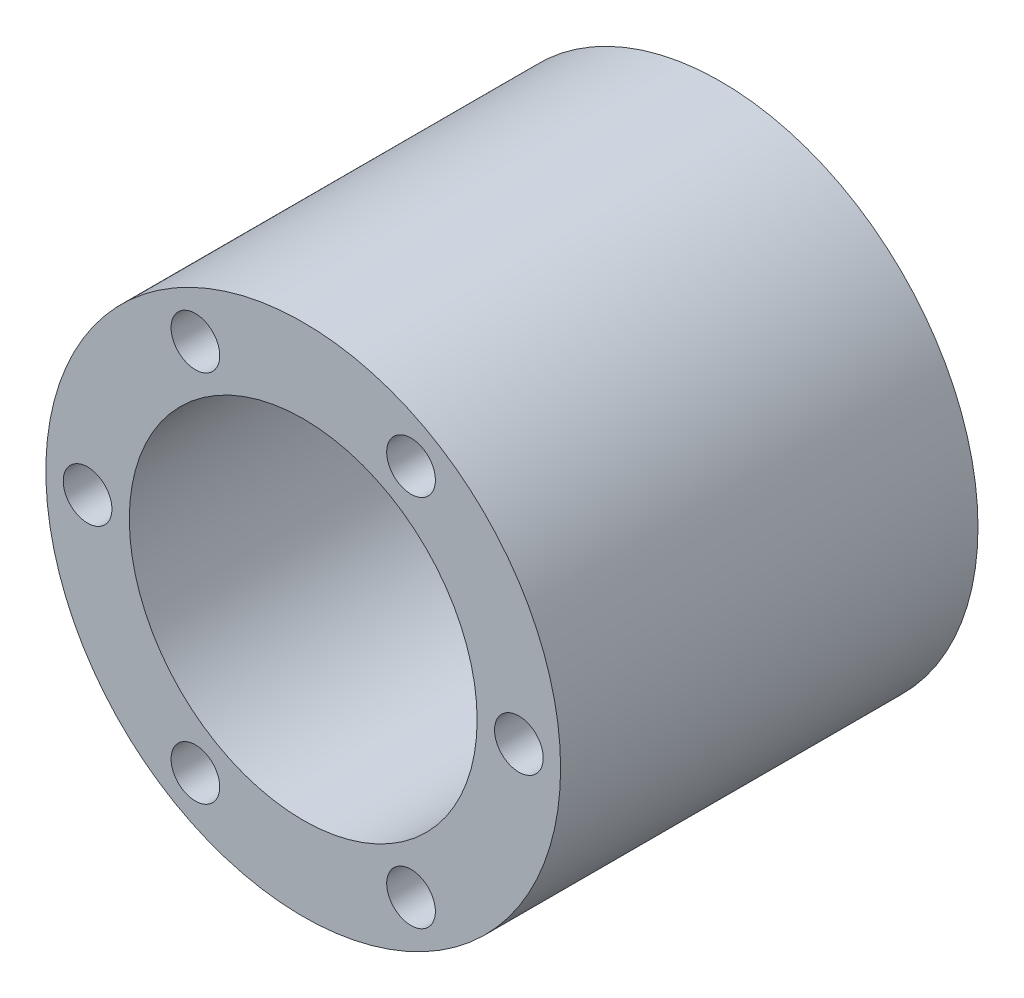
ISO-10303-21;
HEADER;
FILE_DESCRIPTION(('STEP AP214'),'2;1');
FILE_NAME('part.step','',(''),(''),'','','');
FILE_SCHEMA(('AUTOMOTIVE_DESIGN { 1 0 10303 214 1 1 1 1 }'));
ENDSEC;
DATA;
#1=APPLICATION_CONTEXT('core data for automotive mechanical design processes');
#2=APPLICATION_PROTOCOL_DEFINITION('international standard','automotive_design',2000,#1);
#3=PRODUCT_CONTEXT('',#1,'mechanical');
#4=PRODUCT('Part','Part','',(#3));
#5=PRODUCT_RELATED_PRODUCT_CATEGORY('part','',(#4));
#6=PRODUCT_DEFINITION_FORMATION('','',#4);
#7=PRODUCT_DEFINITION_CONTEXT('part definition',#1,'design');
#8=PRODUCT_DEFINITION('design','',#6,#7);
#9=PRODUCT_DEFINITION_SHAPE('','',#8);
#10=(LENGTH_UNIT() NAMED_UNIT(*) SI_UNIT(.MILLI.,.METRE.));
#11=(NAMED_UNIT(*) PLANE_ANGLE_UNIT() SI_UNIT($,.RADIAN.));
#12=(NAMED_UNIT(*) SI_UNIT($,.STERADIAN.) SOLID_ANGLE_UNIT());
#13=UNCERTAINTY_MEASURE_WITH_UNIT(LENGTH_MEASURE(1.E-05),#10,'distance_accuracy_value','');
#14=(GEOMETRIC_REPRESENTATION_CONTEXT(3) GLOBAL_UNCERTAINTY_ASSIGNED_CONTEXT((#13)) GLOBAL_UNIT_ASSIGNED_CONTEXT((#10,
#11,#12)) REPRESENTATION_CONTEXT('',''));
#15=CARTESIAN_POINT('',(0.,0.,0.));
#16=DIRECTION('',(0.,0.,1.));
#17=DIRECTION('',(1.,0.,0.));
#18=AXIS2_PLACEMENT_3D('',#15,#16,#17);
#19=CARTESIAN_POINT('',(0.,0.,30.));
#20=DIRECTION('',(0.,0.,1.));
#21=DIRECTION('',(1.,0.,0.));
#22=AXIS2_PLACEMENT_3D('',#19,#20,#21);
#23=PLANE('',#22);
#24=CARTESIAN_POINT('',(7.74999999999987,-13.4233937586589,30.));
#25=DIRECTION('',(0.,0.,1.));
#26=DIRECTION('',(1.,0.,0.));
#27=AXIS2_PLACEMENT_3D('',#24,#25,#26);
#28=CIRCLE('',#27,1.75);
#29=CARTESIAN_POINT('',(9.49999999999988,-13.4233937586589,30.));
#30=VERTEX_POINT('',#29);
#31=EDGE_CURVE('E90',#30,#30,#28,.T.);
#32=ORIENTED_EDGE('',*,*,#31,.F.);
#33=EDGE_LOOP('',(#32));
#34=FACE_BOUND('',#33,.T.);
#35=CARTESIAN_POINT('',(7.75000000000006,13.4233937586588,30.));
#36=DIRECTION('',(0.,0.,1.));
#37=DIRECTION('',(1.,0.,0.));
#38=AXIS2_PLACEMENT_3D('',#35,#36,#37);
#39=CIRCLE('',#38,1.75);
#40=CARTESIAN_POINT('',(9.50000000000006,13.4233937586588,30.));
#41=VERTEX_POINT('',#40);
#42=EDGE_CURVE('E74',#41,#41,#39,.T.);
#43=ORIENTED_EDGE('',*,*,#42,.F.);
#44=EDGE_LOOP('',(#43));
#45=FACE_BOUND('',#44,.T.);
#46=CARTESIAN_POINT('',(0.,0.,30.));
#47=DIRECTION('',(0.,0.,1.));
#48=DIRECTION('',(1.,0.,0.));
#49=AXIS2_PLACEMENT_3D('',#46,#47,#48);
#50=CIRCLE('',#49,12.5);
#51=CARTESIAN_POINT('',(12.5,0.,30.));
#52=VERTEX_POINT('',#51);
#53=EDGE_CURVE('E58',#52,#52,#50,.T.);
#54=ORIENTED_EDGE('',*,*,#53,.F.);
#55=EDGE_LOOP('',(#54));
#56=FACE_BOUND('',#55,.T.);
#57=CARTESIAN_POINT('',(0.,0.,30.));
#58=DIRECTION('',(0.,0.,1.));
#59=DIRECTION('',(1.,0.,0.));
#60=AXIS2_PLACEMENT_3D('',#57,#58,#59);
#61=CIRCLE('',#60,18.5);
#62=CARTESIAN_POINT('',(18.5,0.,30.));
#63=VERTEX_POINT('',#62);
#64=EDGE_CURVE('E10',#63,#63,#61,.T.);
#65=ORIENTED_EDGE('',*,*,#64,.T.);
#66=EDGE_LOOP('',(#65));
#67=FACE_BOUND('',#66,.T.);
#68=CARTESIAN_POINT('',(-15.5,0.,30.));
#69=DIRECTION('',(0.,0.,1.));
#70=DIRECTION('',(1.,0.,0.));
#71=AXIS2_PLACEMENT_3D('',#68,#69,#70);
#72=CIRCLE('',#71,1.75);
#73=CARTESIAN_POINT('',(-13.75,0.,30.));
#74=VERTEX_POINT('',#73);
#75=EDGE_CURVE('E53',#74,#74,#72,.T.);
#76=ORIENTED_EDGE('',*,*,#75,.F.);
#77=EDGE_LOOP('',(#76));
#78=FACE_BOUND('',#77,.T.);
#79=CARTESIAN_POINT('',(-7.74999999999997,13.4233937586588,30.));
#80=DIRECTION('',(0.,0.,1.));
#81=DIRECTION('',(1.,0.,0.));
#82=AXIS2_PLACEMENT_3D('',#79,#80,#81);
#83=CIRCLE('',#82,1.75);
#84=CARTESIAN_POINT('',(-5.99999999999997,13.4233937586588,30.));
#85=VERTEX_POINT('',#84);
#86=EDGE_CURVE('E66',#85,#85,#83,.T.);
#87=ORIENTED_EDGE('',*,*,#86,.F.);
#88=EDGE_LOOP('',(#87));
#89=FACE_BOUND('',#88,.T.);
#90=CARTESIAN_POINT('',(15.5,-1.08235921504137E-13,30.));
#91=DIRECTION('',(0.,0.,1.));
#92=DIRECTION('',(1.,0.,0.));
#93=AXIS2_PLACEMENT_3D('',#90,#91,#92);
#94=CIRCLE('',#93,1.75);
#95=CARTESIAN_POINT('',(17.25,-1.08235921504137E-13,30.));
#96=VERTEX_POINT('',#95);
#97=EDGE_CURVE('E82',#96,#96,#94,.T.);
#98=ORIENTED_EDGE('',*,*,#97,.F.);
#99=EDGE_LOOP('',(#98));
#100=FACE_BOUND('',#99,.T.);
#101=CARTESIAN_POINT('',(-7.75000000000016,-13.4233937586587,30.));
#102=DIRECTION('',(0.,0.,1.));
#103=DIRECTION('',(1.,0.,0.));
#104=AXIS2_PLACEMENT_3D('',#101,#102,#103);
#105=CIRCLE('',#104,1.75);
#106=CARTESIAN_POINT('',(-6.00000000000015,-13.4233937586587,30.));
#107=VERTEX_POINT('',#106);
#108=EDGE_CURVE('E98',#107,#107,#105,.T.);
#109=ORIENTED_EDGE('',*,*,#108,.F.);
#110=EDGE_LOOP('',(#109));
#111=FACE_BOUND('',#110,.T.);
#112=ADVANCED_FACE('F39',(#34,#45,#56,#67,#78,#89,#100,#111),#23,.T.);
#113=CARTESIAN_POINT('',(0.,0.,0.));
#114=DIRECTION('',(0.,0.,1.));
#115=DIRECTION('',(1.,0.,0.));
#116=AXIS2_PLACEMENT_3D('',#113,#114,#115);
#117=PLANE('',#116);
#118=CARTESIAN_POINT('',(0.,0.,0.));
#119=DIRECTION('',(0.,0.,1.));
#120=DIRECTION('',(1.,0.,0.));
#121=AXIS2_PLACEMENT_3D('',#118,#119,#120);
#122=CIRCLE('',#121,18.5);
#123=CARTESIAN_POINT('',(18.5,0.,0.));
#124=VERTEX_POINT('',#123);
#125=EDGE_CURVE('E43',#124,#124,#122,.T.);
#126=ORIENTED_EDGE('',*,*,#125,.F.);
#127=EDGE_LOOP('',(#126));
#128=FACE_BOUND('',#127,.T.);
#129=CARTESIAN_POINT('',(-15.5,0.,0.));
#130=DIRECTION('',(0.,0.,1.));
#131=DIRECTION('',(1.,0.,0.));
#132=AXIS2_PLACEMENT_3D('',#129,#130,#131);
#133=CIRCLE('',#132,1.75);
#134=CARTESIAN_POINT('',(-13.75,0.,0.));
#135=VERTEX_POINT('',#134);
#136=EDGE_CURVE('E55',#135,#135,#133,.T.);
#137=ORIENTED_EDGE('',*,*,#136,.T.);
#138=EDGE_LOOP('',(#137));
#139=FACE_BOUND('',#138,.T.);
#140=CARTESIAN_POINT('',(0.,0.,0.));
#141=DIRECTION('',(0.,0.,1.));
#142=DIRECTION('',(1.,0.,0.));
#143=AXIS2_PLACEMENT_3D('',#140,#141,#142);
#144=CIRCLE('',#143,12.5);
#145=CARTESIAN_POINT('',(12.5,0.,0.));
#146=VERTEX_POINT('',#145);
#147=EDGE_CURVE('E62',#146,#146,#144,.T.);
#148=ORIENTED_EDGE('',*,*,#147,.T.);
#149=EDGE_LOOP('',(#148));
#150=FACE_BOUND('',#149,.T.);
#151=CARTESIAN_POINT('',(-7.74999999999997,13.4233937586588,0.));
#152=DIRECTION('',(0.,0.,1.));
#153=DIRECTION('',(1.,0.,0.));
#154=AXIS2_PLACEMENT_3D('',#151,#152,#153);
#155=CIRCLE('',#154,1.75);
#156=CARTESIAN_POINT('',(-5.99999999999997,13.4233937586588,0.));
#157=VERTEX_POINT('',#156);
#158=EDGE_CURVE('E70',#157,#157,#155,.T.);
#159=ORIENTED_EDGE('',*,*,#158,.T.);
#160=EDGE_LOOP('',(#159));
#161=FACE_BOUND('',#160,.T.);
#162=CARTESIAN_POINT('',(7.75000000000006,13.4233937586588,0.));
#163=DIRECTION('',(0.,0.,1.));
#164=DIRECTION('',(1.,0.,0.));
#165=AXIS2_PLACEMENT_3D('',#162,#163,#164);
#166=CIRCLE('',#165,1.75);
#167=CARTESIAN_POINT('',(9.50000000000006,13.4233937586588,0.));
#168=VERTEX_POINT('',#167);
#169=EDGE_CURVE('E78',#168,#168,#166,.T.);
#170=ORIENTED_EDGE('',*,*,#169,.T.);
#171=EDGE_LOOP('',(#170));
#172=FACE_BOUND('',#171,.T.);
#173=CARTESIAN_POINT('',(15.5,-1.08235921504137E-13,0.));
#174=DIRECTION('',(0.,0.,1.));
#175=DIRECTION('',(1.,0.,0.));
#176=AXIS2_PLACEMENT_3D('',#173,#174,#175);
#177=CIRCLE('',#176,1.75);
#178=CARTESIAN_POINT('',(17.25,-1.08235921504137E-13,0.));
#179=VERTEX_POINT('',#178);
#180=EDGE_CURVE('E86',#179,#179,#177,.T.);
#181=ORIENTED_EDGE('',*,*,#180,.T.);
#182=EDGE_LOOP('',(#181));
#183=FACE_BOUND('',#182,.T.);
#184=CARTESIAN_POINT('',(7.74999999999987,-13.4233937586589,0.));
#185=DIRECTION('',(0.,0.,1.));
#186=DIRECTION('',(1.,0.,0.));
#187=AXIS2_PLACEMENT_3D('',#184,#185,#186);
#188=CIRCLE('',#187,1.75);
#189=CARTESIAN_POINT('',(9.49999999999988,-13.4233937586589,0.));
#190=VERTEX_POINT('',#189);
#191=EDGE_CURVE('E94',#190,#190,#188,.T.);
#192=ORIENTED_EDGE('',*,*,#191,.T.);
#193=EDGE_LOOP('',(#192));
#194=FACE_BOUND('',#193,.T.);
#195=CARTESIAN_POINT('',(-7.75000000000016,-13.4233937586587,0.));
#196=DIRECTION('',(0.,0.,1.));
#197=DIRECTION('',(1.,0.,0.));
#198=AXIS2_PLACEMENT_3D('',#195,#196,#197);
#199=CIRCLE('',#198,1.75);
#200=CARTESIAN_POINT('',(-6.00000000000015,-13.4233937586587,0.));
#201=VERTEX_POINT('',#200);
#202=EDGE_CURVE('E102',#201,#201,#199,.T.);
#203=ORIENTED_EDGE('',*,*,#202,.T.);
#204=EDGE_LOOP('',(#203));
#205=FACE_BOUND('',#204,.T.);
#206=ADVANCED_FACE('F114',(#128,#139,#150,#161,#172,#183,#194,#205),#117,.F.);
#207=CARTESIAN_POINT('',(0.,0.,30.));
#208=DIRECTION('',(0.,0.,-1.));
#209=DIRECTION('',(-1.,0.,0.));
#210=AXIS2_PLACEMENT_3D('',#207,#208,#209);
#211=CYLINDRICAL_SURFACE('',#210,18.5);
#212=ORIENTED_EDGE('',*,*,#64,.F.);
#213=EDGE_LOOP('',(#212));
#214=FACE_BOUND('',#213,.T.);
#215=ORIENTED_EDGE('',*,*,#125,.T.);
#216=EDGE_LOOP('',(#215));
#217=FACE_BOUND('',#216,.T.);
#218=ADVANCED_FACE('F41',(#214,#217),#211,.T.);
#219=CARTESIAN_POINT('',(-15.5,0.,30.));
#220=DIRECTION('',(0.,0.,-1.));
#221=DIRECTION('',(-1.,0.,0.));
#222=AXIS2_PLACEMENT_3D('',#219,#220,#221);
#223=CYLINDRICAL_SURFACE('',#222,1.75);
#224=ORIENTED_EDGE('',*,*,#75,.T.);
#225=EDGE_LOOP('',(#224));
#226=FACE_BOUND('',#225,.T.);
#227=ORIENTED_EDGE('',*,*,#136,.F.);
#228=EDGE_LOOP('',(#227));
#229=FACE_BOUND('',#228,.T.);
#230=ADVANCED_FACE('F124',(#226,#229),#223,.F.);
#231=CARTESIAN_POINT('',(0.,0.,30.));
#232=DIRECTION('',(0.,0.,-1.));
#233=DIRECTION('',(-1.,0.,0.));
#234=AXIS2_PLACEMENT_3D('',#231,#232,#233);
#235=CYLINDRICAL_SURFACE('',#234,12.5);
#236=ORIENTED_EDGE('',*,*,#53,.T.);
#237=EDGE_LOOP('',(#236));
#238=FACE_BOUND('',#237,.T.);
#239=ORIENTED_EDGE('',*,*,#147,.F.);
#240=EDGE_LOOP('',(#239));
#241=FACE_BOUND('',#240,.T.);
#242=ADVANCED_FACE('F127',(#238,#241),#235,.F.);
#243=CARTESIAN_POINT('',(-7.74999999999997,13.4233937586588,30.));
#244=DIRECTION('',(0.,0.,-1.));
#245=DIRECTION('',(-1.,0.,0.));
#246=AXIS2_PLACEMENT_3D('',#243,#244,#245);
#247=CYLINDRICAL_SURFACE('',#246,1.75);
#248=ORIENTED_EDGE('',*,*,#86,.T.);
#249=EDGE_LOOP('',(#248));
#250=FACE_BOUND('',#249,.T.);
#251=ORIENTED_EDGE('',*,*,#158,.F.);
#252=EDGE_LOOP('',(#251));
#253=FACE_BOUND('',#252,.T.);
#254=ADVANCED_FACE('F131',(#250,#253),#247,.F.);
#255=CARTESIAN_POINT('',(7.75000000000006,13.4233937586588,30.));
#256=DIRECTION('',(0.,0.,-1.));
#257=DIRECTION('',(-1.,0.,0.));
#258=AXIS2_PLACEMENT_3D('',#255,#256,#257);
#259=CYLINDRICAL_SURFACE('',#258,1.75);
#260=ORIENTED_EDGE('',*,*,#42,.T.);
#261=EDGE_LOOP('',(#260));
#262=FACE_BOUND('',#261,.T.);
#263=ORIENTED_EDGE('',*,*,#169,.F.);
#264=EDGE_LOOP('',(#263));
#265=FACE_BOUND('',#264,.T.);
#266=ADVANCED_FACE('F135',(#262,#265),#259,.F.);
#267=CARTESIAN_POINT('',(15.5,-1.08235921504137E-13,30.));
#268=DIRECTION('',(0.,0.,-1.));
#269=DIRECTION('',(-1.,0.,0.));
#270=AXIS2_PLACEMENT_3D('',#267,#268,#269);
#271=CYLINDRICAL_SURFACE('',#270,1.75);
#272=ORIENTED_EDGE('',*,*,#97,.T.);
#273=EDGE_LOOP('',(#272));
#274=FACE_BOUND('',#273,.T.);
#275=ORIENTED_EDGE('',*,*,#180,.F.);
#276=EDGE_LOOP('',(#275));
#277=FACE_BOUND('',#276,.T.);
#278=ADVANCED_FACE('F139',(#274,#277),#271,.F.);
#279=CARTESIAN_POINT('',(7.74999999999987,-13.4233937586589,30.));
#280=DIRECTION('',(0.,0.,-1.));
#281=DIRECTION('',(-1.,0.,0.));
#282=AXIS2_PLACEMENT_3D('',#279,#280,#281);
#283=CYLINDRICAL_SURFACE('',#282,1.75);
#284=ORIENTED_EDGE('',*,*,#31,.T.);
#285=EDGE_LOOP('',(#284));
#286=FACE_BOUND('',#285,.T.);
#287=ORIENTED_EDGE('',*,*,#191,.F.);
#288=EDGE_LOOP('',(#287));
#289=FACE_BOUND('',#288,.T.);
#290=ADVANCED_FACE('F143',(#286,#289),#283,.F.);
#291=CARTESIAN_POINT('',(-7.75000000000016,-13.4233937586587,30.));
#292=DIRECTION('',(0.,0.,-1.));
#293=DIRECTION('',(-1.,0.,0.));
#294=AXIS2_PLACEMENT_3D('',#291,#292,#293);
#295=CYLINDRICAL_SURFACE('',#294,1.75);
#296=ORIENTED_EDGE('',*,*,#108,.T.);
#297=EDGE_LOOP('',(#296));
#298=FACE_BOUND('',#297,.T.);
#299=ORIENTED_EDGE('',*,*,#202,.F.);
#300=EDGE_LOOP('',(#299));
#301=FACE_BOUND('',#300,.T.);
#302=ADVANCED_FACE('F110',(#298,#301),#295,.F.);
#303=CLOSED_SHELL('',(#112,#206,#218,#230,#242,#254,#266,#278,#290,#302));
#304=MANIFOLD_SOLID_BREP('B2',#303);
#305=ADVANCED_BREP_SHAPE_REPRESENTATION('',(#18,#304),#14);
#306=SHAPE_DEFINITION_REPRESENTATION(#9,#305);
ENDSEC;
END-ISO-10303-21;
